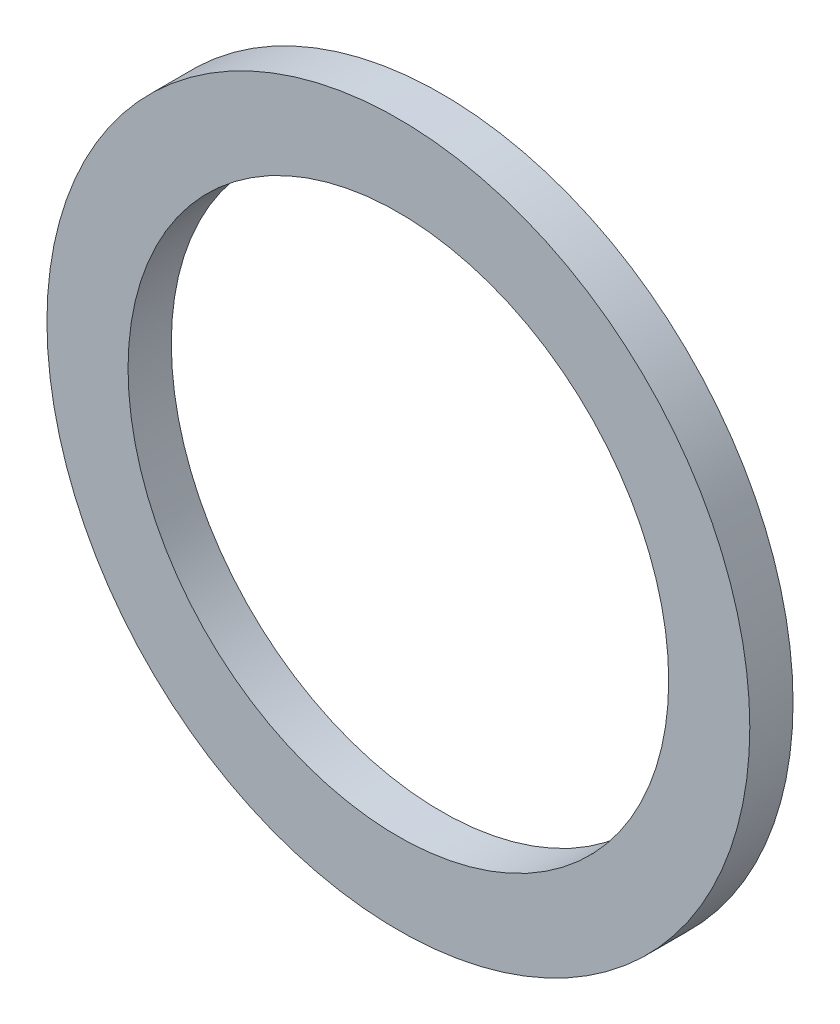
ISO-10303-21;
HEADER;
FILE_DESCRIPTION(('STEP AP214'),'2;1');
FILE_NAME('part.step','',(''),(''),'','','');
FILE_SCHEMA(('AUTOMOTIVE_DESIGN { 1 0 10303 214 1 1 1 1 }'));
ENDSEC;
DATA;
#1=APPLICATION_CONTEXT('core data for automotive mechanical design processes');
#2=APPLICATION_PROTOCOL_DEFINITION('international standard','automotive_design',2000,#1);
#3=PRODUCT_CONTEXT('',#1,'mechanical');
#4=PRODUCT('Part','Part','',(#3));
#5=PRODUCT_RELATED_PRODUCT_CATEGORY('part','',(#4));
#6=PRODUCT_DEFINITION_FORMATION('','',#4);
#7=PRODUCT_DEFINITION_CONTEXT('part definition',#1,'design');
#8=PRODUCT_DEFINITION('design','',#6,#7);
#9=PRODUCT_DEFINITION_SHAPE('','',#8);
#10=(LENGTH_UNIT() NAMED_UNIT(*) SI_UNIT(.MILLI.,.METRE.));
#11=(NAMED_UNIT(*) PLANE_ANGLE_UNIT() SI_UNIT($,.RADIAN.));
#12=(NAMED_UNIT(*) SI_UNIT($,.STERADIAN.) SOLID_ANGLE_UNIT());
#13=UNCERTAINTY_MEASURE_WITH_UNIT(LENGTH_MEASURE(1.E-05),#10,'distance_accuracy_value','');
#14=(GEOMETRIC_REPRESENTATION_CONTEXT(3) GLOBAL_UNCERTAINTY_ASSIGNED_CONTEXT((#13)) GLOBAL_UNIT_ASSIGNED_CONTEXT((#10,
#11,#12)) REPRESENTATION_CONTEXT('',''));
#15=CARTESIAN_POINT('',(0.,0.,0.));
#16=DIRECTION('',(0.,0.,1.));
#17=DIRECTION('',(1.,0.,0.));
#18=AXIS2_PLACEMENT_3D('',#15,#16,#17);
#19=CARTESIAN_POINT('',(0.,0.,0.8));
#20=DIRECTION('',(0.,0.,1.));
#21=DIRECTION('',(1.,0.,0.));
#22=AXIS2_PLACEMENT_3D('',#19,#20,#21);
#23=PLANE('',#22);
#24=CARTESIAN_POINT('',(0.,0.,0.8));
#25=DIRECTION('',(0.,0.,1.));
#26=DIRECTION('',(1.,0.,0.));
#27=AXIS2_PLACEMENT_3D('',#24,#25,#26);
#28=CIRCLE('',#27,6.5);
#29=CARTESIAN_POINT('',(6.5,0.,0.8));
#30=VERTEX_POINT('',#29);
#31=EDGE_CURVE('E10',#30,#30,#28,.T.);
#32=ORIENTED_EDGE('',*,*,#31,.T.);
#33=EDGE_LOOP('',(#32));
#34=FACE_BOUND('',#33,.T.);
#35=CARTESIAN_POINT('',(0.,0.,0.8));
#36=DIRECTION('',(0.,0.,1.));
#37=DIRECTION('',(1.,0.,0.));
#38=AXIS2_PLACEMENT_3D('',#35,#36,#37);
#39=CIRCLE('',#38,5.);
#40=CARTESIAN_POINT('',(5.,0.,0.8));
#41=VERTEX_POINT('',#40);
#42=EDGE_CURVE('E55',#41,#41,#39,.T.);
#43=ORIENTED_EDGE('',*,*,#42,.F.);
#44=EDGE_LOOP('',(#43));
#45=FACE_BOUND('',#44,.T.);
#46=ADVANCED_FACE('F42',(#34,#45),#23,.T.);
#47=CARTESIAN_POINT('',(0.,0.,0.));
#48=DIRECTION('',(0.,0.,1.));
#49=DIRECTION('',(1.,0.,0.));
#50=AXIS2_PLACEMENT_3D('',#47,#48,#49);
#51=PLANE('',#50);
#52=CARTESIAN_POINT('',(0.,0.,0.));
#53=DIRECTION('',(0.,0.,1.));
#54=DIRECTION('',(1.,0.,0.));
#55=AXIS2_PLACEMENT_3D('',#52,#53,#54);
#56=CIRCLE('',#55,6.5);
#57=CARTESIAN_POINT('',(6.5,0.,0.));
#58=VERTEX_POINT('',#57);
#59=EDGE_CURVE('E46',#58,#58,#56,.T.);
#60=ORIENTED_EDGE('',*,*,#59,.F.);
#61=EDGE_LOOP('',(#60));
#62=FACE_BOUND('',#61,.T.);
#63=CARTESIAN_POINT('',(0.,0.,0.));
#64=DIRECTION('',(0.,0.,1.));
#65=DIRECTION('',(1.,0.,0.));
#66=AXIS2_PLACEMENT_3D('',#63,#64,#65);
#67=CIRCLE('',#66,5.);
#68=CARTESIAN_POINT('',(5.,0.,0.));
#69=VERTEX_POINT('',#68);
#70=EDGE_CURVE('E57',#69,#69,#67,.T.);
#71=ORIENTED_EDGE('',*,*,#70,.T.);
#72=EDGE_LOOP('',(#71));
#73=FACE_BOUND('',#72,.T.);
#74=ADVANCED_FACE('F69',(#62,#73),#51,.F.);
#75=CARTESIAN_POINT('',(0.,0.,0.8));
#76=DIRECTION('',(0.,0.,-1.));
#77=DIRECTION('',(-1.,0.,0.));
#78=AXIS2_PLACEMENT_3D('',#75,#76,#77);
#79=CYLINDRICAL_SURFACE('',#78,6.5);
#80=ORIENTED_EDGE('',*,*,#31,.F.);
#81=EDGE_LOOP('',(#80));
#82=FACE_BOUND('',#81,.T.);
#83=ORIENTED_EDGE('',*,*,#59,.T.);
#84=EDGE_LOOP('',(#83));
#85=FACE_BOUND('',#84,.T.);
#86=ADVANCED_FACE('F44',(#82,#85),#79,.T.);
#87=CARTESIAN_POINT('',(0.,0.,0.8));
#88=DIRECTION('',(0.,0.,-1.));
#89=DIRECTION('',(-1.,0.,0.));
#90=AXIS2_PLACEMENT_3D('',#87,#88,#89);
#91=CYLINDRICAL_SURFACE('',#90,5.);
#92=ORIENTED_EDGE('',*,*,#42,.T.);
#93=EDGE_LOOP('',(#92));
#94=FACE_BOUND('',#93,.T.);
#95=ORIENTED_EDGE('',*,*,#70,.F.);
#96=EDGE_LOOP('',(#95));
#97=FACE_BOUND('',#96,.T.);
#98=ADVANCED_FACE('F65',(#94,#97),#91,.F.);
#99=CLOSED_SHELL('',(#46,#74,#86,#98));
#100=MANIFOLD_SOLID_BREP('B2',#99);
#101=ADVANCED_BREP_SHAPE_REPRESENTATION('',(#18,#100),#14);
#102=SHAPE_DEFINITION_REPRESENTATION(#9,#101);
ENDSEC;
END-ISO-10303-21;
